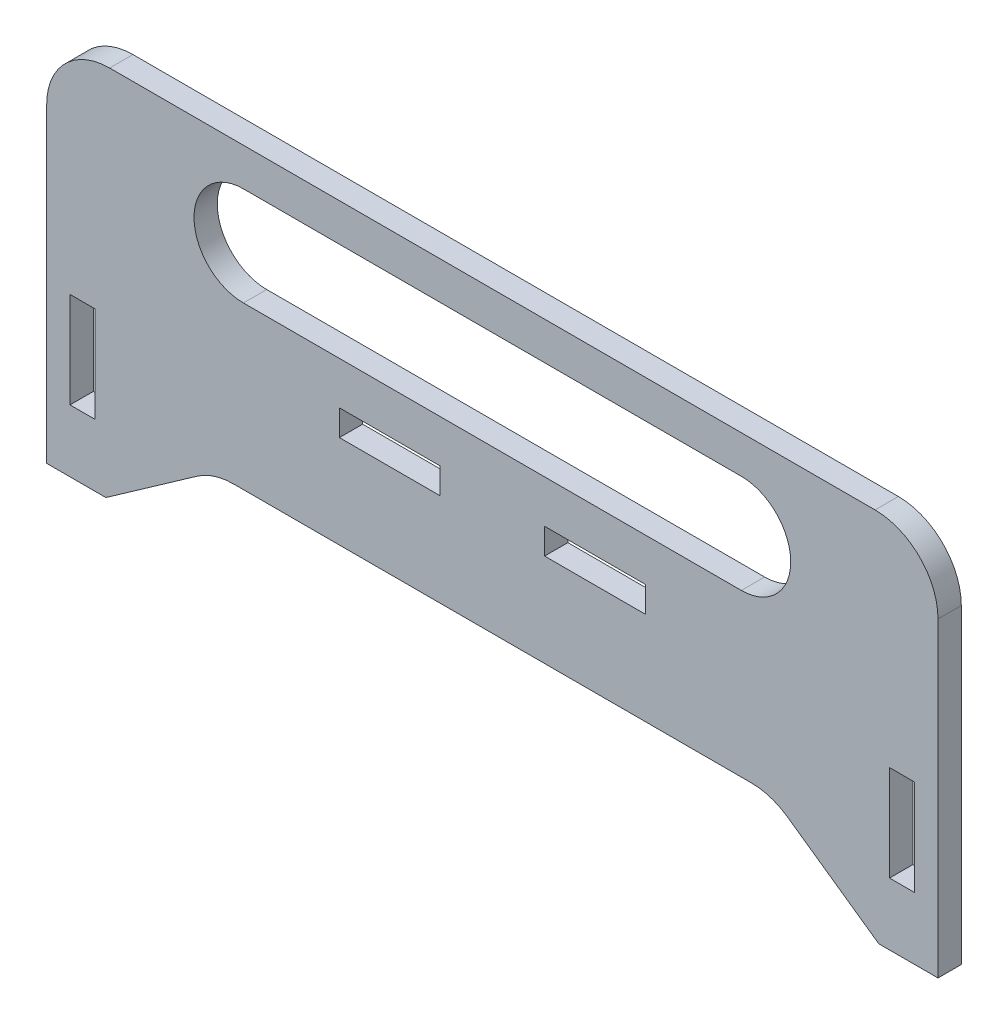
ISO-10303-21;
HEADER;
FILE_DESCRIPTION(('STEP AP214'),'2;1');
FILE_NAME('part.step','',(''),(''),'','','');
FILE_SCHEMA(('AUTOMOTIVE_DESIGN { 1 0 10303 214 1 1 1 1 }'));
ENDSEC;
DATA;
#1=APPLICATION_CONTEXT('core data for automotive mechanical design processes');
#2=APPLICATION_PROTOCOL_DEFINITION('international standard','automotive_design',2000,#1);
#3=PRODUCT_CONTEXT('',#1,'mechanical');
#4=PRODUCT('Part','Part','',(#3));
#5=PRODUCT_RELATED_PRODUCT_CATEGORY('part','',(#4));
#6=PRODUCT_DEFINITION_FORMATION('','',#4);
#7=PRODUCT_DEFINITION_CONTEXT('part definition',#1,'design');
#8=PRODUCT_DEFINITION('design','',#6,#7);
#9=PRODUCT_DEFINITION_SHAPE('','',#8);
#10=(LENGTH_UNIT() NAMED_UNIT(*) SI_UNIT(.MILLI.,.METRE.));
#11=(NAMED_UNIT(*) PLANE_ANGLE_UNIT() SI_UNIT($,.RADIAN.));
#12=(NAMED_UNIT(*) SI_UNIT($,.STERADIAN.) SOLID_ANGLE_UNIT());
#13=UNCERTAINTY_MEASURE_WITH_UNIT(LENGTH_MEASURE(1.E-05),#10,'distance_accuracy_value','');
#14=(GEOMETRIC_REPRESENTATION_CONTEXT(3) GLOBAL_UNCERTAINTY_ASSIGNED_CONTEXT((#13)) GLOBAL_UNIT_ASSIGNED_CONTEXT((#10,
#11,#12)) REPRESENTATION_CONTEXT('',''));
#15=CARTESIAN_POINT('',(0.,0.,0.));
#16=DIRECTION('',(0.,0.,1.));
#17=DIRECTION('',(1.,0.,0.));
#18=AXIS2_PLACEMENT_3D('',#15,#16,#17);
#19=CARTESIAN_POINT('',(0.,0.,3.7));
#20=DIRECTION('',(0.,0.,1.));
#21=DIRECTION('',(1.,0.,0.));
#22=AXIS2_PLACEMENT_3D('',#19,#20,#21);
#23=PLANE('',#22);
#24=DIRECTION('',(-1.,0.,0.));
#25=VECTOR('',#24,1.);
#26=CARTESIAN_POINT('',(-110.178290247756,0.,3.7));
#27=LINE('',#26,#25);
#28=CARTESIAN_POINT('',(21.4217097522439,0.,3.7));
#29=VERTEX_POINT('',#28);
#30=CARTESIAN_POINT('',(-100.178290247756,0.,3.7));
#31=VERTEX_POINT('',#30);
#32=EDGE_CURVE('E427',#29,#31,#27,.T.);
#33=ORIENTED_EDGE('',*,*,#32,.T.);
#34=CARTESIAN_POINT('',(-100.178290247756,-10.,3.7));
#35=DIRECTION('',(0.,0.,1.));
#36=DIRECTION('',(1.,0.,0.));
#37=AXIS2_PLACEMENT_3D('',#34,#35,#36);
#38=CIRCLE('',#37,10.);
#39=CARTESIAN_POINT('',(-110.178290247756,-10.,3.7));
#40=VERTEX_POINT('',#39);
#41=EDGE_CURVE('E473',#31,#40,#38,.T.);
#42=ORIENTED_EDGE('',*,*,#41,.T.);
#43=DIRECTION('',(0.,-1.,0.));
#44=VECTOR('',#43,1.);
#45=CARTESIAN_POINT('',(-110.178290247756,0.,3.7));
#46=LINE('',#45,#44);
#47=CARTESIAN_POINT('',(-110.178290247756,-59.4,3.7));
#48=VERTEX_POINT('',#47);
#49=EDGE_CURVE('E410',#40,#48,#46,.T.);
#50=ORIENTED_EDGE('',*,*,#49,.T.);
#51=DIRECTION('',(1.,0.,0.));
#52=VECTOR('',#51,1.);
#53=CARTESIAN_POINT('',(-110.178290247756,-59.4,3.7));
#54=LINE('',#53,#52);
#55=CARTESIAN_POINT('',(-100.778290247756,-59.4,3.7));
#56=VERTEX_POINT('',#55);
#57=EDGE_CURVE('E412',#48,#56,#54,.T.);
#58=ORIENTED_EDGE('',*,*,#57,.T.);
#59=DIRECTION('',(0.818181818181818,0.574959574576069,0.));
#60=VECTOR('',#59,1.);
#61=CARTESIAN_POINT('',(-100.778290247756,-59.4,3.7));
#62=LINE('',#61,#60);
#63=CARTESIAN_POINT('',(-86.2656083333484,-49.201526709542,3.7));
#64=VERTEX_POINT('',#63);
#65=EDGE_CURVE('E415',#56,#64,#62,.T.);
#66=ORIENTED_EDGE('',*,*,#65,.T.);
#67=CARTESIAN_POINT('',(-80.5160125875877,-57.3833448913602,3.7));
#68=DIRECTION('',(0.,0.,1.));
#69=DIRECTION('',(1.,0.,0.));
#70=AXIS2_PLACEMENT_3D('',#67,#68,#69);
#71=CIRCLE('',#70,10.);
#72=CARTESIAN_POINT('',(-80.5160125875877,-47.3833448913602,3.7));
#73=VERTEX_POINT('',#72);
#74=EDGE_CURVE('E11',#64,#73,#71,.F.);
#75=ORIENTED_EDGE('',*,*,#74,.T.);
#76=DIRECTION('',(1.,0.,0.));
#77=VECTOR('',#76,1.);
#78=CARTESIAN_POINT('',(-83.6782902477561,-47.3833448913602,3.7));
#79=LINE('',#78,#77);
#80=CARTESIAN_POINT('',(1.75943209207553,-47.3833448913602,3.7));
#81=VERTEX_POINT('',#80);
#82=EDGE_CURVE('E417',#73,#81,#79,.T.);
#83=ORIENTED_EDGE('',*,*,#82,.T.);
#84=CARTESIAN_POINT('',(1.75943209207554,-57.3833448913602,3.7));
#85=DIRECTION('',(0.,0.,1.));
#86=DIRECTION('',(1.,0.,0.));
#87=AXIS2_PLACEMENT_3D('',#84,#85,#86);
#88=CIRCLE('',#87,10.);
#89=CARTESIAN_POINT('',(7.50902783783623,-49.201526709542,3.7));
#90=VERTEX_POINT('',#89);
#91=EDGE_CURVE('E488',#81,#90,#88,.F.);
#92=ORIENTED_EDGE('',*,*,#91,.T.);
#93=DIRECTION('',(0.818181818181818,-0.574959574576069,0.));
#94=VECTOR('',#93,1.);
#95=CARTESIAN_POINT('',(4.92170975224391,-47.3833448913602,3.7));
#96=LINE('',#95,#94);
#97=CARTESIAN_POINT('',(22.0217097522439,-59.4,3.7));
#98=VERTEX_POINT('',#97);
#99=EDGE_CURVE('E420',#90,#98,#96,.T.);
#100=ORIENTED_EDGE('',*,*,#99,.T.);
#101=DIRECTION('',(1.,0.,0.));
#102=VECTOR('',#101,1.);
#103=CARTESIAN_POINT('',(22.0217097522439,-59.4,3.7));
#104=LINE('',#103,#102);
#105=CARTESIAN_POINT('',(31.4217097522439,-59.4,3.7));
#106=VERTEX_POINT('',#105);
#107=EDGE_CURVE('E422',#98,#106,#104,.T.);
#108=ORIENTED_EDGE('',*,*,#107,.T.);
#109=DIRECTION('',(0.,1.,0.));
#110=VECTOR('',#109,1.);
#111=CARTESIAN_POINT('',(31.4217097522439,0.,3.7));
#112=LINE('',#111,#110);
#113=CARTESIAN_POINT('',(31.4217097522439,-10.,3.7));
#114=VERTEX_POINT('',#113);
#115=EDGE_CURVE('E424',#106,#114,#112,.T.);
#116=ORIENTED_EDGE('',*,*,#115,.T.);
#117=CARTESIAN_POINT('',(21.4217097522439,-10.,3.7));
#118=DIRECTION('',(0.,0.,1.));
#119=DIRECTION('',(1.,0.,0.));
#120=AXIS2_PLACEMENT_3D('',#117,#118,#119);
#121=CIRCLE('',#120,10.);
#122=EDGE_CURVE('E471',#114,#29,#121,.T.);
#123=ORIENTED_EDGE('',*,*,#122,.T.);
#124=EDGE_LOOP('',(#33,#42,#50,#58,#66,#75,#83,#92,#100,#108,#116,#123));
#125=FACE_BOUND('',#124,.T.);
#126=DIRECTION('',(-1.,0.,0.));
#127=VECTOR('',#126,1.);
#128=CARTESIAN_POINT('',(0.171709752243898,-5.99999999999999,3.7));
#129=LINE('',#128,#127);
#130=CARTESIAN_POINT('',(0.171709752243898,-5.99999999999999,3.7));
#131=VERTEX_POINT('',#130);
#132=CARTESIAN_POINT('',(-78.9282902477561,-5.99999999999999,3.7));
#133=VERTEX_POINT('',#132);
#134=EDGE_CURVE('E381',#131,#133,#129,.T.);
#135=ORIENTED_EDGE('',*,*,#134,.F.);
#136=CARTESIAN_POINT('',(0.171709752243897,-13.85,3.7));
#137=DIRECTION('',(0.,0.,1.));
#138=DIRECTION('',(1.,0.,0.));
#139=AXIS2_PLACEMENT_3D('',#136,#137,#138);
#140=CIRCLE('',#139,7.84999999999999);
#141=CARTESIAN_POINT('',(0.171709752243898,-21.7,3.7));
#142=VERTEX_POINT('',#141);
#143=EDGE_CURVE('E379',#142,#131,#140,.T.);
#144=ORIENTED_EDGE('',*,*,#143,.F.);
#145=DIRECTION('',(1.,0.,0.));
#146=VECTOR('',#145,1.);
#147=CARTESIAN_POINT('',(0.171709752243898,-21.7,3.7));
#148=LINE('',#147,#146);
#149=CARTESIAN_POINT('',(-78.9282902477561,-21.7,3.7));
#150=VERTEX_POINT('',#149);
#151=EDGE_CURVE('E387',#150,#142,#148,.T.);
#152=ORIENTED_EDGE('',*,*,#151,.F.);
#153=CARTESIAN_POINT('',(-78.9282902477561,-13.85,3.7));
#154=DIRECTION('',(0.,0.,1.));
#155=DIRECTION('',(1.,0.,0.));
#156=AXIS2_PLACEMENT_3D('',#153,#154,#155);
#157=CIRCLE('',#156,7.84999999999999);
#158=EDGE_CURVE('E384',#133,#150,#157,.T.);
#159=ORIENTED_EDGE('',*,*,#158,.F.);
#160=EDGE_LOOP('',(#135,#144,#152,#159));
#161=FACE_BOUND('',#160,.T.);
#162=DIRECTION('',(1.,0.,0.));
#163=VECTOR('',#162,1.);
#164=CARTESIAN_POINT('',(-47.6782902477561,-32.6,3.7));
#165=LINE('',#164,#163);
#166=CARTESIAN_POINT('',(-63.6782902477561,-32.6,3.7));
#167=VERTEX_POINT('',#166);
#168=CARTESIAN_POINT('',(-47.6782902477561,-32.6,3.7));
#169=VERTEX_POINT('',#168);
#170=EDGE_CURVE('E350',#167,#169,#165,.T.);
#171=ORIENTED_EDGE('',*,*,#170,.F.);
#172=DIRECTION('',(0.,-1.,0.));
#173=VECTOR('',#172,1.);
#174=CARTESIAN_POINT('',(-63.6782902477561,-32.6,3.7));
#175=LINE('',#174,#173);
#176=CARTESIAN_POINT('',(-63.6782902477561,-28.5,3.7));
#177=VERTEX_POINT('',#176);
#178=EDGE_CURVE('E348',#177,#167,#175,.T.);
#179=ORIENTED_EDGE('',*,*,#178,.F.);
#180=DIRECTION('',(-1.,0.,0.));
#181=VECTOR('',#180,1.);
#182=CARTESIAN_POINT('',(-47.6782902477561,-28.5,3.7));
#183=LINE('',#182,#181);
#184=CARTESIAN_POINT('',(-47.6782902477561,-28.5,3.7));
#185=VERTEX_POINT('',#184);
#186=EDGE_CURVE('E356',#185,#177,#183,.T.);
#187=ORIENTED_EDGE('',*,*,#186,.F.);
#188=DIRECTION('',(0.,1.,0.));
#189=VECTOR('',#188,1.);
#190=CARTESIAN_POINT('',(-47.6782902477561,-32.6,3.7));
#191=LINE('',#190,#189);
#192=EDGE_CURVE('E353',#169,#185,#191,.T.);
#193=ORIENTED_EDGE('',*,*,#192,.F.);
#194=EDGE_LOOP('',(#171,#179,#187,#193));
#195=FACE_BOUND('',#194,.T.);
#196=DIRECTION('',(0.,1.,0.));
#197=VECTOR('',#196,1.);
#198=CARTESIAN_POINT('',(-15.0782902477561,-32.6,3.7));
#199=LINE('',#198,#197);
#200=CARTESIAN_POINT('',(-15.0782902477561,-32.6,3.7));
#201=VERTEX_POINT('',#200);
#202=CARTESIAN_POINT('',(-15.0782902477561,-28.5,3.7));
#203=VERTEX_POINT('',#202);
#204=EDGE_CURVE('E319',#201,#203,#199,.T.);
#205=ORIENTED_EDGE('',*,*,#204,.F.);
#206=DIRECTION('',(1.,0.,0.));
#207=VECTOR('',#206,1.);
#208=CARTESIAN_POINT('',(-31.0782902477561,-32.6,3.7));
#209=LINE('',#208,#207);
#210=CARTESIAN_POINT('',(-31.0782902477561,-32.6,3.7));
#211=VERTEX_POINT('',#210);
#212=EDGE_CURVE('E317',#211,#201,#209,.T.);
#213=ORIENTED_EDGE('',*,*,#212,.F.);
#214=DIRECTION('',(0.,-1.,0.));
#215=VECTOR('',#214,1.);
#216=CARTESIAN_POINT('',(-31.0782902477561,-32.6,3.7));
#217=LINE('',#216,#215);
#218=CARTESIAN_POINT('',(-31.0782902477561,-28.5,3.7));
#219=VERTEX_POINT('',#218);
#220=EDGE_CURVE('E325',#219,#211,#217,.T.);
#221=ORIENTED_EDGE('',*,*,#220,.F.);
#222=DIRECTION('',(-1.,0.,0.));
#223=VECTOR('',#222,1.);
#224=CARTESIAN_POINT('',(-31.0782902477561,-28.5,3.7));
#225=LINE('',#224,#223);
#226=EDGE_CURVE('E322',#203,#219,#225,.T.);
#227=ORIENTED_EDGE('',*,*,#226,.F.);
#228=EDGE_LOOP('',(#205,#213,#221,#227));
#229=FACE_BOUND('',#228,.T.);
#230=DIRECTION('',(-1.,0.,0.));
#231=VECTOR('',#230,1.);
#232=CARTESIAN_POINT('',(-106.478290247756,-34.3,3.7));
#233=LINE('',#232,#231);
#234=CARTESIAN_POINT('',(-102.478290247756,-34.3,3.7));
#235=VERTEX_POINT('',#234);
#236=CARTESIAN_POINT('',(-106.478290247756,-34.3,3.7));
#237=VERTEX_POINT('',#236);
#238=EDGE_CURVE('E288',#235,#237,#233,.T.);
#239=ORIENTED_EDGE('',*,*,#238,.F.);
#240=DIRECTION('',(0.,1.,0.));
#241=VECTOR('',#240,1.);
#242=CARTESIAN_POINT('',(-102.478290247756,-34.3,3.7));
#243=LINE('',#242,#241);
#244=CARTESIAN_POINT('',(-102.478290247756,-49.5,3.7));
#245=VERTEX_POINT('',#244);
#246=EDGE_CURVE('E286',#245,#235,#243,.T.);
#247=ORIENTED_EDGE('',*,*,#246,.F.);
#248=DIRECTION('',(1.,0.,0.));
#249=VECTOR('',#248,1.);
#250=CARTESIAN_POINT('',(-106.478290247756,-49.5,3.7));
#251=LINE('',#250,#249);
#252=CARTESIAN_POINT('',(-106.478290247756,-49.5,3.7));
#253=VERTEX_POINT('',#252);
#254=EDGE_CURVE('E294',#253,#245,#251,.T.);
#255=ORIENTED_EDGE('',*,*,#254,.F.);
#256=DIRECTION('',(0.,-1.,0.));
#257=VECTOR('',#256,1.);
#258=CARTESIAN_POINT('',(-106.478290247756,-34.3,3.7));
#259=LINE('',#258,#257);
#260=EDGE_CURVE('E291',#237,#253,#259,.T.);
#261=ORIENTED_EDGE('',*,*,#260,.F.);
#262=EDGE_LOOP('',(#239,#247,#255,#261));
#263=FACE_BOUND('',#262,.T.);
#264=DIRECTION('',(-1.,0.,0.));
#265=VECTOR('',#264,1.);
#266=CARTESIAN_POINT('',(27.7217097522439,-34.3,3.7));
#267=LINE('',#266,#265);
#268=CARTESIAN_POINT('',(27.7217097522439,-34.3,3.7));
#269=VERTEX_POINT('',#268);
#270=CARTESIAN_POINT('',(23.7217097522439,-34.3,3.7));
#271=VERTEX_POINT('',#270);
#272=EDGE_CURVE('E255',#269,#271,#267,.T.);
#273=ORIENTED_EDGE('',*,*,#272,.F.);
#274=DIRECTION('',(0.,1.,0.));
#275=VECTOR('',#274,1.);
#276=CARTESIAN_POINT('',(27.7217097522439,-34.3,3.7));
#277=LINE('',#276,#275);
#278=CARTESIAN_POINT('',(27.7217097522439,-49.5,3.7));
#279=VERTEX_POINT('',#278);
#280=EDGE_CURVE('E245',#279,#269,#277,.T.);
#281=ORIENTED_EDGE('',*,*,#280,.F.);
#282=DIRECTION('',(1.,0.,0.));
#283=VECTOR('',#282,1.);
#284=CARTESIAN_POINT('',(27.7217097522439,-49.5,3.7));
#285=LINE('',#284,#283);
#286=CARTESIAN_POINT('',(23.7217097522439,-49.5,3.7));
#287=VERTEX_POINT('',#286);
#288=EDGE_CURVE('E270',#287,#279,#285,.T.);
#289=ORIENTED_EDGE('',*,*,#288,.F.);
#290=DIRECTION('',(0.,-1.,0.));
#291=VECTOR('',#290,1.);
#292=CARTESIAN_POINT('',(23.7217097522439,-34.3,3.7));
#293=LINE('',#292,#291);
#294=EDGE_CURVE('E268',#271,#287,#293,.T.);
#295=ORIENTED_EDGE('',*,*,#294,.F.);
#296=EDGE_LOOP('',(#273,#281,#289,#295));
#297=FACE_BOUND('',#296,.T.);
#298=ADVANCED_FACE('F35',(#125,#161,#195,#229,#263,#297),#23,.T.);
#299=CARTESIAN_POINT('',(0.,0.,0.));
#300=DIRECTION('',(0.,0.,1.));
#301=DIRECTION('',(1.,0.,0.));
#302=AXIS2_PLACEMENT_3D('',#299,#300,#301);
#303=PLANE('',#302);
#304=DIRECTION('',(0.,1.,0.));
#305=VECTOR('',#304,1.);
#306=CARTESIAN_POINT('',(-102.478290247756,-34.3,0.));
#307=LINE('',#306,#305);
#308=CARTESIAN_POINT('',(-102.478290247756,-49.5,0.));
#309=VERTEX_POINT('',#308);
#310=CARTESIAN_POINT('',(-102.478290247756,-34.3,0.));
#311=VERTEX_POINT('',#310);
#312=EDGE_CURVE('E263',#309,#311,#307,.T.);
#313=ORIENTED_EDGE('',*,*,#312,.T.);
#314=DIRECTION('',(-1.,0.,0.));
#315=VECTOR('',#314,1.);
#316=CARTESIAN_POINT('',(-106.478290247756,-34.3,0.));
#317=LINE('',#316,#315);
#318=CARTESIAN_POINT('',(-106.478290247756,-34.3,0.));
#319=VERTEX_POINT('',#318);
#320=EDGE_CURVE('E299',#311,#319,#317,.T.);
#321=ORIENTED_EDGE('',*,*,#320,.T.);
#322=DIRECTION('',(0.,-1.,0.));
#323=VECTOR('',#322,1.);
#324=CARTESIAN_POINT('',(-106.478290247756,-34.3,0.));
#325=LINE('',#324,#323);
#326=CARTESIAN_POINT('',(-106.478290247756,-49.5,0.));
#327=VERTEX_POINT('',#326);
#328=EDGE_CURVE('E302',#319,#327,#325,.T.);
#329=ORIENTED_EDGE('',*,*,#328,.T.);
#330=DIRECTION('',(1.,0.,0.));
#331=VECTOR('',#330,1.);
#332=CARTESIAN_POINT('',(-106.478290247756,-49.5,0.));
#333=LINE('',#332,#331);
#334=EDGE_CURVE('E289',#327,#309,#333,.T.);
#335=ORIENTED_EDGE('',*,*,#334,.T.);
#336=EDGE_LOOP('',(#313,#321,#329,#335));
#337=FACE_BOUND('',#336,.T.);
#338=DIRECTION('',(0.,-1.,0.));
#339=VECTOR('',#338,1.);
#340=CARTESIAN_POINT('',(-63.6782902477561,-32.6,0.));
#341=LINE('',#340,#339);
#342=CARTESIAN_POINT('',(-63.6782902477561,-28.5,0.));
#343=VERTEX_POINT('',#342);
#344=CARTESIAN_POINT('',(-63.6782902477561,-32.6,0.));
#345=VERTEX_POINT('',#344);
#346=EDGE_CURVE('E347',#343,#345,#341,.T.);
#347=ORIENTED_EDGE('',*,*,#346,.T.);
#348=DIRECTION('',(1.,0.,0.));
#349=VECTOR('',#348,1.);
#350=CARTESIAN_POINT('',(-47.6782902477561,-32.6,0.));
#351=LINE('',#350,#349);
#352=CARTESIAN_POINT('',(-47.6782902477561,-32.6,0.));
#353=VERTEX_POINT('',#352);
#354=EDGE_CURVE('E361',#345,#353,#351,.T.);
#355=ORIENTED_EDGE('',*,*,#354,.T.);
#356=DIRECTION('',(0.,1.,0.));
#357=VECTOR('',#356,1.);
#358=CARTESIAN_POINT('',(-47.6782902477561,-32.6,0.));
#359=LINE('',#358,#357);
#360=CARTESIAN_POINT('',(-47.6782902477561,-28.5,0.));
#361=VERTEX_POINT('',#360);
#362=EDGE_CURVE('E364',#353,#361,#359,.T.);
#363=ORIENTED_EDGE('',*,*,#362,.T.);
#364=DIRECTION('',(-1.,0.,0.));
#365=VECTOR('',#364,1.);
#366=CARTESIAN_POINT('',(-47.6782902477561,-28.5,0.));
#367=LINE('',#366,#365);
#368=EDGE_CURVE('E351',#361,#343,#367,.T.);
#369=ORIENTED_EDGE('',*,*,#368,.T.);
#370=EDGE_LOOP('',(#347,#355,#363,#369));
#371=FACE_BOUND('',#370,.T.);
#372=DIRECTION('',(0.,-1.,0.));
#373=VECTOR('',#372,1.);
#374=CARTESIAN_POINT('',(-110.178290247756,0.,0.));
#375=LINE('',#374,#373);
#376=CARTESIAN_POINT('',(-110.178290247756,-10.,0.));
#377=VERTEX_POINT('',#376);
#378=CARTESIAN_POINT('',(-110.178290247756,-59.4,0.));
#379=VERTEX_POINT('',#378);
#380=EDGE_CURVE('E409',#377,#379,#375,.T.);
#381=ORIENTED_EDGE('',*,*,#380,.F.);
#382=CARTESIAN_POINT('',(-100.178290247756,-10.,0.));
#383=DIRECTION('',(0.,0.,1.));
#384=DIRECTION('',(1.,0.,0.));
#385=AXIS2_PLACEMENT_3D('',#382,#383,#384);
#386=CIRCLE('',#385,10.);
#387=CARTESIAN_POINT('',(-100.178290247756,0.,0.));
#388=VERTEX_POINT('',#387);
#389=EDGE_CURVE('E464',#377,#388,#386,.F.);
#390=ORIENTED_EDGE('',*,*,#389,.T.);
#391=DIRECTION('',(-1.,0.,0.));
#392=VECTOR('',#391,1.);
#393=CARTESIAN_POINT('',(-110.178290247756,0.,0.));
#394=LINE('',#393,#392);
#395=CARTESIAN_POINT('',(21.4217097522439,0.,0.));
#396=VERTEX_POINT('',#395);
#397=EDGE_CURVE('E413',#396,#388,#394,.T.);
#398=ORIENTED_EDGE('',*,*,#397,.F.);
#399=CARTESIAN_POINT('',(21.4217097522439,-10.,0.));
#400=DIRECTION('',(0.,0.,1.));
#401=DIRECTION('',(1.,0.,0.));
#402=AXIS2_PLACEMENT_3D('',#399,#400,#401);
#403=CIRCLE('',#402,10.);
#404=CARTESIAN_POINT('',(31.4217097522439,-10.,0.));
#405=VERTEX_POINT('',#404);
#406=EDGE_CURVE('E462',#396,#405,#403,.F.);
#407=ORIENTED_EDGE('',*,*,#406,.T.);
#408=DIRECTION('',(0.,1.,0.));
#409=VECTOR('',#408,1.);
#410=CARTESIAN_POINT('',(31.4217097522439,0.,0.));
#411=LINE('',#410,#409);
#412=CARTESIAN_POINT('',(31.4217097522439,-59.4,0.));
#413=VERTEX_POINT('',#412);
#414=EDGE_CURVE('E443',#413,#405,#411,.T.);
#415=ORIENTED_EDGE('',*,*,#414,.F.);
#416=DIRECTION('',(1.,0.,0.));
#417=VECTOR('',#416,1.);
#418=CARTESIAN_POINT('',(22.0217097522439,-59.4,0.));
#419=LINE('',#418,#417);
#420=CARTESIAN_POINT('',(22.0217097522439,-59.4,0.));
#421=VERTEX_POINT('',#420);
#422=EDGE_CURVE('E441',#421,#413,#419,.T.);
#423=ORIENTED_EDGE('',*,*,#422,.F.);
#424=DIRECTION('',(0.818181818181818,-0.574959574576069,0.));
#425=VECTOR('',#424,1.);
#426=CARTESIAN_POINT('',(4.92170975224391,-47.3833448913602,0.));
#427=LINE('',#426,#425);
#428=CARTESIAN_POINT('',(7.50902783783623,-49.201526709542,0.));
#429=VERTEX_POINT('',#428);
#430=EDGE_CURVE('E439',#429,#421,#427,.T.);
#431=ORIENTED_EDGE('',*,*,#430,.F.);
#432=CARTESIAN_POINT('',(1.75943209207554,-57.3833448913602,0.));
#433=DIRECTION('',(0.,0.,1.));
#434=DIRECTION('',(1.,0.,0.));
#435=AXIS2_PLACEMENT_3D('',#432,#433,#434);
#436=CIRCLE('',#435,10.);
#437=CARTESIAN_POINT('',(1.75943209207553,-47.3833448913602,0.));
#438=VERTEX_POINT('',#437);
#439=EDGE_CURVE('E486',#429,#438,#436,.T.);
#440=ORIENTED_EDGE('',*,*,#439,.T.);
#441=DIRECTION('',(1.,0.,0.));
#442=VECTOR('',#441,1.);
#443=CARTESIAN_POINT('',(-83.6782902477561,-47.3833448913602,0.));
#444=LINE('',#443,#442);
#445=CARTESIAN_POINT('',(-80.5160125875877,-47.3833448913602,0.));
#446=VERTEX_POINT('',#445);
#447=EDGE_CURVE('E436',#446,#438,#444,.T.);
#448=ORIENTED_EDGE('',*,*,#447,.F.);
#449=CARTESIAN_POINT('',(-80.5160125875877,-57.3833448913602,0.));
#450=DIRECTION('',(0.,0.,1.));
#451=DIRECTION('',(1.,0.,0.));
#452=AXIS2_PLACEMENT_3D('',#449,#450,#451);
#453=CIRCLE('',#452,10.);
#454=CARTESIAN_POINT('',(-86.2656083333484,-49.201526709542,0.));
#455=VERTEX_POINT('',#454);
#456=EDGE_CURVE('E43',#446,#455,#453,.T.);
#457=ORIENTED_EDGE('',*,*,#456,.T.);
#458=DIRECTION('',(0.818181818181818,0.574959574576069,0.));
#459=VECTOR('',#458,1.);
#460=CARTESIAN_POINT('',(-100.778290247756,-59.4,0.));
#461=LINE('',#460,#459);
#462=CARTESIAN_POINT('',(-100.778290247756,-59.4,0.));
#463=VERTEX_POINT('',#462);
#464=EDGE_CURVE('E434',#463,#455,#461,.T.);
#465=ORIENTED_EDGE('',*,*,#464,.F.);
#466=DIRECTION('',(1.,0.,0.));
#467=VECTOR('',#466,1.);
#468=CARTESIAN_POINT('',(-110.178290247756,-59.4,0.));
#469=LINE('',#468,#467);
#470=EDGE_CURVE('E432',#379,#463,#469,.T.);
#471=ORIENTED_EDGE('',*,*,#470,.F.);
#472=EDGE_LOOP('',(#381,#390,#398,#407,#415,#423,#431,#440,#448,#457,#465,#471));
#473=FACE_BOUND('',#472,.T.);
#474=CARTESIAN_POINT('',(0.171709752243897,-13.85,0.));
#475=DIRECTION('',(0.,0.,1.));
#476=DIRECTION('',(1.,0.,0.));
#477=AXIS2_PLACEMENT_3D('',#474,#475,#476);
#478=CIRCLE('',#477,7.84999999999999);
#479=CARTESIAN_POINT('',(0.171709752243898,-21.7,0.));
#480=VERTEX_POINT('',#479);
#481=CARTESIAN_POINT('',(0.171709752243898,-5.99999999999999,0.));
#482=VERTEX_POINT('',#481);
#483=EDGE_CURVE('E378',#480,#482,#478,.T.);
#484=ORIENTED_EDGE('',*,*,#483,.T.);
#485=DIRECTION('',(-1.,0.,0.));
#486=VECTOR('',#485,1.);
#487=CARTESIAN_POINT('',(0.171709752243898,-5.99999999999999,0.));
#488=LINE('',#487,#486);
#489=CARTESIAN_POINT('',(-78.9282902477561,-5.99999999999999,0.));
#490=VERTEX_POINT('',#489);
#491=EDGE_CURVE('E392',#482,#490,#488,.T.);
#492=ORIENTED_EDGE('',*,*,#491,.T.);
#493=CARTESIAN_POINT('',(-78.9282902477561,-13.85,0.));
#494=DIRECTION('',(0.,0.,1.));
#495=DIRECTION('',(1.,0.,0.));
#496=AXIS2_PLACEMENT_3D('',#493,#494,#495);
#497=CIRCLE('',#496,7.84999999999999);
#498=CARTESIAN_POINT('',(-78.9282902477561,-21.7,0.));
#499=VERTEX_POINT('',#498);
#500=EDGE_CURVE('E395',#490,#499,#497,.T.);
#501=ORIENTED_EDGE('',*,*,#500,.T.);
#502=DIRECTION('',(1.,0.,0.));
#503=VECTOR('',#502,1.);
#504=CARTESIAN_POINT('',(0.171709752243898,-21.7,0.));
#505=LINE('',#504,#503);
#506=EDGE_CURVE('E382',#499,#480,#505,.T.);
#507=ORIENTED_EDGE('',*,*,#506,.T.);
#508=EDGE_LOOP('',(#484,#492,#501,#507));
#509=FACE_BOUND('',#508,.T.);
#510=DIRECTION('',(1.,0.,0.));
#511=VECTOR('',#510,1.);
#512=CARTESIAN_POINT('',(-31.0782902477561,-32.6,0.));
#513=LINE('',#512,#511);
#514=CARTESIAN_POINT('',(-31.0782902477561,-32.6,0.));
#515=VERTEX_POINT('',#514);
#516=CARTESIAN_POINT('',(-15.0782902477561,-32.6,0.));
#517=VERTEX_POINT('',#516);
#518=EDGE_CURVE('E316',#515,#517,#513,.T.);
#519=ORIENTED_EDGE('',*,*,#518,.T.);
#520=DIRECTION('',(0.,1.,0.));
#521=VECTOR('',#520,1.);
#522=CARTESIAN_POINT('',(-15.0782902477561,-32.6,0.));
#523=LINE('',#522,#521);
#524=CARTESIAN_POINT('',(-15.0782902477561,-28.5,0.));
#525=VERTEX_POINT('',#524);
#526=EDGE_CURVE('E330',#517,#525,#523,.T.);
#527=ORIENTED_EDGE('',*,*,#526,.T.);
#528=DIRECTION('',(-1.,0.,0.));
#529=VECTOR('',#528,1.);
#530=CARTESIAN_POINT('',(-31.0782902477561,-28.5,0.));
#531=LINE('',#530,#529);
#532=CARTESIAN_POINT('',(-31.0782902477561,-28.5,0.));
#533=VERTEX_POINT('',#532);
#534=EDGE_CURVE('E333',#525,#533,#531,.T.);
#535=ORIENTED_EDGE('',*,*,#534,.T.);
#536=DIRECTION('',(0.,-1.,0.));
#537=VECTOR('',#536,1.);
#538=CARTESIAN_POINT('',(-31.0782902477561,-32.6,0.));
#539=LINE('',#538,#537);
#540=EDGE_CURVE('E320',#533,#515,#539,.T.);
#541=ORIENTED_EDGE('',*,*,#540,.T.);
#542=EDGE_LOOP('',(#519,#527,#535,#541));
#543=FACE_BOUND('',#542,.T.);
#544=DIRECTION('',(0.,1.,0.));
#545=VECTOR('',#544,1.);
#546=CARTESIAN_POINT('',(27.7217097522439,-34.3,0.));
#547=LINE('',#546,#545);
#548=CARTESIAN_POINT('',(27.7217097522439,-49.5,0.));
#549=VERTEX_POINT('',#548);
#550=CARTESIAN_POINT('',(27.7217097522439,-34.3,0.));
#551=VERTEX_POINT('',#550);
#552=EDGE_CURVE('E274',#549,#551,#547,.T.);
#553=ORIENTED_EDGE('',*,*,#552,.T.);
#554=DIRECTION('',(-1.,0.,0.));
#555=VECTOR('',#554,1.);
#556=CARTESIAN_POINT('',(27.7217097522439,-34.3,0.));
#557=LINE('',#556,#555);
#558=CARTESIAN_POINT('',(23.7217097522439,-34.3,0.));
#559=VERTEX_POINT('',#558);
#560=EDGE_CURVE('E262',#551,#559,#557,.T.);
#561=ORIENTED_EDGE('',*,*,#560,.T.);
#562=DIRECTION('',(0.,-1.,0.));
#563=VECTOR('',#562,1.);
#564=CARTESIAN_POINT('',(23.7217097522439,-34.3,0.));
#565=LINE('',#564,#563);
#566=CARTESIAN_POINT('',(23.7217097522439,-49.5,0.));
#567=VERTEX_POINT('',#566);
#568=EDGE_CURVE('E277',#559,#567,#565,.T.);
#569=ORIENTED_EDGE('',*,*,#568,.T.);
#570=DIRECTION('',(1.,0.,0.));
#571=VECTOR('',#570,1.);
#572=CARTESIAN_POINT('',(27.7217097522439,-49.5,0.));
#573=LINE('',#572,#571);
#574=EDGE_CURVE('E256',#567,#549,#573,.T.);
#575=ORIENTED_EDGE('',*,*,#574,.T.);
#576=EDGE_LOOP('',(#553,#561,#569,#575));
#577=FACE_BOUND('',#576,.T.);
#578=ADVANCED_FACE('F504',(#337,#371,#473,#509,#543,#577),#303,.F.);
#579=CARTESIAN_POINT('',(-110.178290247756,0.,3.7));
#580=DIRECTION('',(1.,0.,0.));
#581=DIRECTION('',(0.,0.,-1.));
#582=AXIS2_PLACEMENT_3D('',#579,#580,#581);
#583=PLANE('',#582);
#584=ORIENTED_EDGE('',*,*,#49,.F.);
#585=DIRECTION('',(0.,0.,-1.));
#586=VECTOR('',#585,1.);
#587=CARTESIAN_POINT('',(-110.178290247756,-10.,3.7));
#588=LINE('',#587,#586);
#589=EDGE_CURVE('E459',#40,#377,#588,.T.);
#590=ORIENTED_EDGE('',*,*,#589,.T.);
#591=ORIENTED_EDGE('',*,*,#380,.T.);
#592=DIRECTION('',(0.,0.,-1.));
#593=VECTOR('',#592,1.);
#594=CARTESIAN_POINT('',(-110.178290247756,-59.4,3.7));
#595=LINE('',#594,#593);
#596=EDGE_CURVE('E456',#48,#379,#595,.T.);
#597=ORIENTED_EDGE('',*,*,#596,.F.);
#598=EDGE_LOOP('',(#584,#590,#591,#597));
#599=FACE_BOUND('',#598,.T.);
#600=ADVANCED_FACE('F521',(#599),#583,.F.);
#601=CARTESIAN_POINT('',(-110.178290247756,-59.4,3.7));
#602=DIRECTION('',(0.,1.,0.));
#603=DIRECTION('',(0.,0.,1.));
#604=AXIS2_PLACEMENT_3D('',#601,#602,#603);
#605=PLANE('',#604);
#606=ORIENTED_EDGE('',*,*,#470,.T.);
#607=DIRECTION('',(0.,0.,-1.));
#608=VECTOR('',#607,1.);
#609=CARTESIAN_POINT('',(-100.778290247756,-59.4,3.7));
#610=LINE('',#609,#608);
#611=EDGE_CURVE('E453',#56,#463,#610,.T.);
#612=ORIENTED_EDGE('',*,*,#611,.F.);
#613=ORIENTED_EDGE('',*,*,#57,.F.);
#614=ORIENTED_EDGE('',*,*,#596,.T.);
#615=EDGE_LOOP('',(#606,#612,#613,#614));
#616=FACE_BOUND('',#615,.T.);
#617=ADVANCED_FACE('F518',(#616),#605,.F.);
#618=CARTESIAN_POINT('',(-100.778290247756,-59.4,3.7));
#619=DIRECTION('',(-0.574959574576069,0.818181818181818,0.));
#620=DIRECTION('',(-0.818181818181818,-0.574959574576069,0.));
#621=AXIS2_PLACEMENT_3D('',#618,#619,#620);
#622=PLANE('',#621);
#623=ORIENTED_EDGE('',*,*,#464,.T.);
#624=DIRECTION('',(0.,0.,-1.));
#625=VECTOR('',#624,1.);
#626=CARTESIAN_POINT('',(-86.2656083333484,-49.201526709542,3.7));
#627=LINE('',#626,#625);
#628=EDGE_CURVE('E50',#455,#64,#627,.F.);
#629=ORIENTED_EDGE('',*,*,#628,.T.);
#630=ORIENTED_EDGE('',*,*,#65,.F.);
#631=ORIENTED_EDGE('',*,*,#611,.T.);
#632=EDGE_LOOP('',(#623,#629,#630,#631));
#633=FACE_BOUND('',#632,.T.);
#634=ADVANCED_FACE('F514',(#633),#622,.F.);
#635=CARTESIAN_POINT('',(-83.6782902477561,-47.3833448913602,3.7));
#636=DIRECTION('',(0.,1.,0.));
#637=DIRECTION('',(0.,0.,1.));
#638=AXIS2_PLACEMENT_3D('',#635,#636,#637);
#639=PLANE('',#638);
#640=ORIENTED_EDGE('',*,*,#447,.T.);
#641=DIRECTION('',(0.,0.,-1.));
#642=VECTOR('',#641,1.);
#643=CARTESIAN_POINT('',(1.75943209207554,-47.3833448913602,3.7));
#644=LINE('',#643,#642);
#645=EDGE_CURVE('E483',#438,#81,#644,.F.);
#646=ORIENTED_EDGE('',*,*,#645,.T.);
#647=ORIENTED_EDGE('',*,*,#82,.F.);
#648=DIRECTION('',(0.,0.,-1.));
#649=VECTOR('',#648,1.);
#650=CARTESIAN_POINT('',(-80.5160125875877,-47.3833448913602,0.));
#651=LINE('',#650,#649);
#652=EDGE_CURVE('E480',#73,#446,#651,.T.);
#653=ORIENTED_EDGE('',*,*,#652,.T.);
#654=EDGE_LOOP('',(#640,#646,#647,#653));
#655=FACE_BOUND('',#654,.T.);
#656=ADVANCED_FACE('F508',(#655),#639,.F.);
#657=CARTESIAN_POINT('',(4.92170975224391,-47.3833448913602,3.7));
#658=DIRECTION('',(0.574959574576069,0.818181818181818,0.));
#659=DIRECTION('',(-0.818181818181818,0.574959574576069,0.));
#660=AXIS2_PLACEMENT_3D('',#657,#658,#659);
#661=PLANE('',#660);
#662=ORIENTED_EDGE('',*,*,#99,.F.);
#663=DIRECTION('',(0.,0.,-1.));
#664=VECTOR('',#663,1.);
#665=CARTESIAN_POINT('',(7.50902783783623,-49.201526709542,0.));
#666=LINE('',#665,#664);
#667=EDGE_CURVE('E477',#90,#429,#666,.T.);
#668=ORIENTED_EDGE('',*,*,#667,.T.);
#669=ORIENTED_EDGE('',*,*,#430,.T.);
#670=DIRECTION('',(0.,0.,-1.));
#671=VECTOR('',#670,1.);
#672=CARTESIAN_POINT('',(22.0217097522439,-59.4,3.7));
#673=LINE('',#672,#671);
#674=EDGE_CURVE('E450',#98,#421,#673,.T.);
#675=ORIENTED_EDGE('',*,*,#674,.F.);
#676=EDGE_LOOP('',(#662,#668,#669,#675));
#677=FACE_BOUND('',#676,.T.);
#678=ADVANCED_FACE('F499',(#677),#661,.F.);
#679=CARTESIAN_POINT('',(22.0217097522439,-59.4,3.7));
#680=DIRECTION('',(0.,1.,0.));
#681=DIRECTION('',(0.,0.,1.));
#682=AXIS2_PLACEMENT_3D('',#679,#680,#681);
#683=PLANE('',#682);
#684=ORIENTED_EDGE('',*,*,#422,.T.);
#685=DIRECTION('',(0.,0.,-1.));
#686=VECTOR('',#685,1.);
#687=CARTESIAN_POINT('',(31.4217097522439,-59.4,3.7));
#688=LINE('',#687,#686);
#689=EDGE_CURVE('E430',#106,#413,#688,.T.);
#690=ORIENTED_EDGE('',*,*,#689,.F.);
#691=ORIENTED_EDGE('',*,*,#107,.F.);
#692=ORIENTED_EDGE('',*,*,#674,.T.);
#693=EDGE_LOOP('',(#684,#690,#691,#692));
#694=FACE_BOUND('',#693,.T.);
#695=ADVANCED_FACE('F542',(#694),#683,.F.);
#696=CARTESIAN_POINT('',(31.4217097522439,0.,3.7));
#697=DIRECTION('',(-1.,0.,0.));
#698=DIRECTION('',(0.,0.,1.));
#699=AXIS2_PLACEMENT_3D('',#696,#697,#698);
#700=PLANE('',#699);
#701=ORIENTED_EDGE('',*,*,#414,.T.);
#702=DIRECTION('',(0.,0.,-1.));
#703=VECTOR('',#702,1.);
#704=CARTESIAN_POINT('',(31.4217097522439,-10.,3.7));
#705=LINE('',#704,#703);
#706=EDGE_CURVE('E475',#405,#114,#705,.F.);
#707=ORIENTED_EDGE('',*,*,#706,.T.);
#708=ORIENTED_EDGE('',*,*,#115,.F.);
#709=ORIENTED_EDGE('',*,*,#689,.T.);
#710=EDGE_LOOP('',(#701,#707,#708,#709));
#711=FACE_BOUND('',#710,.T.);
#712=ADVANCED_FACE('F538',(#711),#700,.F.);
#713=CARTESIAN_POINT('',(-110.178290247756,0.,3.7));
#714=DIRECTION('',(0.,-1.,0.));
#715=DIRECTION('',(0.,0.,-1.));
#716=AXIS2_PLACEMENT_3D('',#713,#714,#715);
#717=PLANE('',#716);
#718=ORIENTED_EDGE('',*,*,#397,.T.);
#719=DIRECTION('',(0.,0.,-1.));
#720=VECTOR('',#719,1.);
#721=CARTESIAN_POINT('',(-100.178290247756,0.,3.7));
#722=LINE('',#721,#720);
#723=EDGE_CURVE('E469',#388,#31,#722,.F.);
#724=ORIENTED_EDGE('',*,*,#723,.T.);
#725=ORIENTED_EDGE('',*,*,#32,.F.);
#726=DIRECTION('',(0.,0.,-1.));
#727=VECTOR('',#726,1.);
#728=CARTESIAN_POINT('',(21.4217097522439,0.,3.7));
#729=LINE('',#728,#727);
#730=EDGE_CURVE('E466',#29,#396,#729,.T.);
#731=ORIENTED_EDGE('',*,*,#730,.T.);
#732=EDGE_LOOP('',(#718,#724,#725,#731));
#733=FACE_BOUND('',#732,.T.);
#734=ADVANCED_FACE('F529',(#733),#717,.F.);
#735=CARTESIAN_POINT('',(0.171709752243897,-13.85,3.7));
#736=DIRECTION('',(0.,0.,-1.));
#737=DIRECTION('',(-1.,0.,0.));
#738=AXIS2_PLACEMENT_3D('',#735,#736,#737);
#739=CYLINDRICAL_SURFACE('',#738,7.84999999999999);
#740=ORIENTED_EDGE('',*,*,#483,.F.);
#741=DIRECTION('',(0.,0.,-1.));
#742=VECTOR('',#741,1.);
#743=CARTESIAN_POINT('',(0.171709752243898,-21.7,3.7));
#744=LINE('',#743,#742);
#745=EDGE_CURVE('E389',#142,#480,#744,.T.);
#746=ORIENTED_EDGE('',*,*,#745,.F.);
#747=ORIENTED_EDGE('',*,*,#143,.T.);
#748=DIRECTION('',(0.,0.,-1.));
#749=VECTOR('',#748,1.);
#750=CARTESIAN_POINT('',(0.171709752243898,-5.99999999999999,3.7));
#751=LINE('',#750,#749);
#752=EDGE_CURVE('E406',#131,#482,#751,.T.);
#753=ORIENTED_EDGE('',*,*,#752,.T.);
#754=EDGE_LOOP('',(#740,#746,#747,#753));
#755=FACE_BOUND('',#754,.T.);
#756=ADVANCED_FACE('F559',(#755),#739,.F.);
#757=CARTESIAN_POINT('',(0.171709752243898,-5.99999999999999,3.7));
#758=DIRECTION('',(0.,-1.,0.));
#759=DIRECTION('',(1.,0.,0.));
#760=AXIS2_PLACEMENT_3D('',#757,#758,#759);
#761=PLANE('',#760);
#762=ORIENTED_EDGE('',*,*,#491,.F.);
#763=ORIENTED_EDGE('',*,*,#752,.F.);
#764=ORIENTED_EDGE('',*,*,#134,.T.);
#765=DIRECTION('',(0.,0.,-1.));
#766=VECTOR('',#765,1.);
#767=CARTESIAN_POINT('',(-78.9282902477561,-5.99999999999999,3.7));
#768=LINE('',#767,#766);
#769=EDGE_CURVE('E404',#133,#490,#768,.T.);
#770=ORIENTED_EDGE('',*,*,#769,.T.);
#771=EDGE_LOOP('',(#762,#763,#764,#770));
#772=FACE_BOUND('',#771,.T.);
#773=ADVANCED_FACE('F566',(#772),#761,.T.);
#774=CARTESIAN_POINT('',(-78.9282902477561,-13.85,3.7));
#775=DIRECTION('',(0.,0.,-1.));
#776=DIRECTION('',(-1.,0.,0.));
#777=AXIS2_PLACEMENT_3D('',#774,#775,#776);
#778=CYLINDRICAL_SURFACE('',#777,7.84999999999999);
#779=ORIENTED_EDGE('',*,*,#500,.F.);
#780=ORIENTED_EDGE('',*,*,#769,.F.);
#781=ORIENTED_EDGE('',*,*,#158,.T.);
#782=DIRECTION('',(0.,0.,-1.));
#783=VECTOR('',#782,1.);
#784=CARTESIAN_POINT('',(-78.9282902477561,-21.7,3.7));
#785=LINE('',#784,#783);
#786=EDGE_CURVE('E402',#150,#499,#785,.T.);
#787=ORIENTED_EDGE('',*,*,#786,.T.);
#788=EDGE_LOOP('',(#779,#780,#781,#787));
#789=FACE_BOUND('',#788,.T.);
#790=ADVANCED_FACE('F571',(#789),#778,.F.);
#791=CARTESIAN_POINT('',(0.171709752243898,-21.7,3.7));
#792=DIRECTION('',(0.,1.,0.));
#793=DIRECTION('',(-1.,0.,0.));
#794=AXIS2_PLACEMENT_3D('',#791,#792,#793);
#795=PLANE('',#794);
#796=ORIENTED_EDGE('',*,*,#506,.F.);
#797=ORIENTED_EDGE('',*,*,#786,.F.);
#798=ORIENTED_EDGE('',*,*,#151,.T.);
#799=ORIENTED_EDGE('',*,*,#745,.T.);
#800=EDGE_LOOP('',(#796,#797,#798,#799));
#801=FACE_BOUND('',#800,.T.);
#802=ADVANCED_FACE('F578',(#801),#795,.T.);
#803=CARTESIAN_POINT('',(-63.6782902477561,-32.6,3.7));
#804=DIRECTION('',(1.,0.,0.));
#805=DIRECTION('',(0.,0.,-1.));
#806=AXIS2_PLACEMENT_3D('',#803,#804,#805);
#807=PLANE('',#806);
#808=ORIENTED_EDGE('',*,*,#346,.F.);
#809=DIRECTION('',(0.,0.,-1.));
#810=VECTOR('',#809,1.);
#811=CARTESIAN_POINT('',(-63.6782902477561,-28.5,3.7));
#812=LINE('',#811,#810);
#813=EDGE_CURVE('E358',#177,#343,#812,.T.);
#814=ORIENTED_EDGE('',*,*,#813,.F.);
#815=ORIENTED_EDGE('',*,*,#178,.T.);
#816=DIRECTION('',(0.,0.,-1.));
#817=VECTOR('',#816,1.);
#818=CARTESIAN_POINT('',(-63.6782902477561,-32.6,3.7));
#819=LINE('',#818,#817);
#820=EDGE_CURVE('E375',#167,#345,#819,.T.);
#821=ORIENTED_EDGE('',*,*,#820,.T.);
#822=EDGE_LOOP('',(#808,#814,#815,#821));
#823=FACE_BOUND('',#822,.T.);
#824=ADVANCED_FACE('F654',(#823),#807,.T.);
#825=CARTESIAN_POINT('',(-47.6782902477561,-32.6,3.7));
#826=DIRECTION('',(0.,1.,0.));
#827=DIRECTION('',(0.,0.,1.));
#828=AXIS2_PLACEMENT_3D('',#825,#826,#827);
#829=PLANE('',#828);
#830=ORIENTED_EDGE('',*,*,#354,.F.);
#831=ORIENTED_EDGE('',*,*,#820,.F.);
#832=ORIENTED_EDGE('',*,*,#170,.T.);
#833=DIRECTION('',(0.,0.,-1.));
#834=VECTOR('',#833,1.);
#835=CARTESIAN_POINT('',(-47.6782902477561,-32.6,3.7));
#836=LINE('',#835,#834);
#837=EDGE_CURVE('E373',#169,#353,#836,.T.);
#838=ORIENTED_EDGE('',*,*,#837,.T.);
#839=EDGE_LOOP('',(#830,#831,#832,#838));
#840=FACE_BOUND('',#839,.T.);
#841=ADVANCED_FACE('F650',(#840),#829,.T.);
#842=CARTESIAN_POINT('',(-47.6782902477561,-32.6,3.7));
#843=DIRECTION('',(-1.,0.,0.));
#844=DIRECTION('',(0.,0.,1.));
#845=AXIS2_PLACEMENT_3D('',#842,#843,#844);
#846=PLANE('',#845);
#847=ORIENTED_EDGE('',*,*,#362,.F.);
#848=ORIENTED_EDGE('',*,*,#837,.F.);
#849=ORIENTED_EDGE('',*,*,#192,.T.);
#850=DIRECTION('',(0.,0.,-1.));
#851=VECTOR('',#850,1.);
#852=CARTESIAN_POINT('',(-47.6782902477561,-28.5,3.7));
#853=LINE('',#852,#851);
#854=EDGE_CURVE('E371',#185,#361,#853,.T.);
#855=ORIENTED_EDGE('',*,*,#854,.T.);
#856=EDGE_LOOP('',(#847,#848,#849,#855));
#857=FACE_BOUND('',#856,.T.);
#858=ADVANCED_FACE('F646',(#857),#846,.T.);
#859=CARTESIAN_POINT('',(-47.6782902477561,-28.5,3.7));
#860=DIRECTION('',(0.,-1.,0.));
#861=DIRECTION('',(0.,0.,-1.));
#862=AXIS2_PLACEMENT_3D('',#859,#860,#861);
#863=PLANE('',#862);
#864=ORIENTED_EDGE('',*,*,#368,.F.);
#865=ORIENTED_EDGE('',*,*,#854,.F.);
#866=ORIENTED_EDGE('',*,*,#186,.T.);
#867=ORIENTED_EDGE('',*,*,#813,.T.);
#868=EDGE_LOOP('',(#864,#865,#866,#867));
#869=FACE_BOUND('',#868,.T.);
#870=ADVANCED_FACE('F642',(#869),#863,.T.);
#871=CARTESIAN_POINT('',(-31.0782902477561,-32.6,3.7));
#872=DIRECTION('',(0.,1.,0.));
#873=DIRECTION('',(-1.,0.,0.));
#874=AXIS2_PLACEMENT_3D('',#871,#872,#873);
#875=PLANE('',#874);
#876=ORIENTED_EDGE('',*,*,#518,.F.);
#877=DIRECTION('',(0.,0.,-1.));
#878=VECTOR('',#877,1.);
#879=CARTESIAN_POINT('',(-31.0782902477561,-32.6,3.7));
#880=LINE('',#879,#878);
#881=EDGE_CURVE('E327',#211,#515,#880,.T.);
#882=ORIENTED_EDGE('',*,*,#881,.F.);
#883=ORIENTED_EDGE('',*,*,#212,.T.);
#884=DIRECTION('',(0.,0.,-1.));
#885=VECTOR('',#884,1.);
#886=CARTESIAN_POINT('',(-15.0782902477561,-32.6,3.7));
#887=LINE('',#886,#885);
#888=EDGE_CURVE('E344',#201,#517,#887,.T.);
#889=ORIENTED_EDGE('',*,*,#888,.T.);
#890=EDGE_LOOP('',(#876,#882,#883,#889));
#891=FACE_BOUND('',#890,.T.);
#892=ADVANCED_FACE('F638',(#891),#875,.T.);
#893=CARTESIAN_POINT('',(-15.0782902477561,-32.6,3.7));
#894=DIRECTION('',(-1.,0.,0.));
#895=DIRECTION('',(0.,0.,1.));
#896=AXIS2_PLACEMENT_3D('',#893,#894,#895);
#897=PLANE('',#896);
#898=ORIENTED_EDGE('',*,*,#526,.F.);
#899=ORIENTED_EDGE('',*,*,#888,.F.);
#900=ORIENTED_EDGE('',*,*,#204,.T.);
#901=DIRECTION('',(0.,0.,-1.));
#902=VECTOR('',#901,1.);
#903=CARTESIAN_POINT('',(-15.0782902477561,-28.5,3.7));
#904=LINE('',#903,#902);
#905=EDGE_CURVE('E342',#203,#525,#904,.T.);
#906=ORIENTED_EDGE('',*,*,#905,.T.);
#907=EDGE_LOOP('',(#898,#899,#900,#906));
#908=FACE_BOUND('',#907,.T.);
#909=ADVANCED_FACE('F634',(#908),#897,.T.);
#910=CARTESIAN_POINT('',(-31.0782902477561,-28.5,3.7));
#911=DIRECTION('',(0.,-1.,0.));
#912=DIRECTION('',(1.,0.,0.));
#913=AXIS2_PLACEMENT_3D('',#910,#911,#912);
#914=PLANE('',#913);
#915=ORIENTED_EDGE('',*,*,#534,.F.);
#916=ORIENTED_EDGE('',*,*,#905,.F.);
#917=ORIENTED_EDGE('',*,*,#226,.T.);
#918=DIRECTION('',(0.,0.,-1.));
#919=VECTOR('',#918,1.);
#920=CARTESIAN_POINT('',(-31.0782902477561,-28.5,3.7));
#921=LINE('',#920,#919);
#922=EDGE_CURVE('E340',#219,#533,#921,.T.);
#923=ORIENTED_EDGE('',*,*,#922,.T.);
#924=EDGE_LOOP('',(#915,#916,#917,#923));
#925=FACE_BOUND('',#924,.T.);
#926=ADVANCED_FACE('F630',(#925),#914,.T.);
#927=CARTESIAN_POINT('',(-31.0782902477561,-32.6,3.7));
#928=DIRECTION('',(1.,0.,0.));
#929=DIRECTION('',(0.,1.,0.));
#930=AXIS2_PLACEMENT_3D('',#927,#928,#929);
#931=PLANE('',#930);
#932=ORIENTED_EDGE('',*,*,#540,.F.);
#933=ORIENTED_EDGE('',*,*,#922,.F.);
#934=ORIENTED_EDGE('',*,*,#220,.T.);
#935=ORIENTED_EDGE('',*,*,#881,.T.);
#936=EDGE_LOOP('',(#932,#933,#934,#935));
#937=FACE_BOUND('',#936,.T.);
#938=ADVANCED_FACE('F627',(#937),#931,.T.);
#939=CARTESIAN_POINT('',(-102.478290247756,-34.3,3.7));
#940=DIRECTION('',(-1.,0.,0.));
#941=DIRECTION('',(0.,0.,1.));
#942=AXIS2_PLACEMENT_3D('',#939,#940,#941);
#943=PLANE('',#942);
#944=ORIENTED_EDGE('',*,*,#312,.F.);
#945=DIRECTION('',(0.,0.,-1.));
#946=VECTOR('',#945,1.);
#947=CARTESIAN_POINT('',(-102.478290247756,-49.5,3.7));
#948=LINE('',#947,#946);
#949=EDGE_CURVE('E296',#245,#309,#948,.T.);
#950=ORIENTED_EDGE('',*,*,#949,.F.);
#951=ORIENTED_EDGE('',*,*,#246,.T.);
#952=DIRECTION('',(0.,0.,-1.));
#953=VECTOR('',#952,1.);
#954=CARTESIAN_POINT('',(-102.478290247756,-34.3,3.7));
#955=LINE('',#954,#953);
#956=EDGE_CURVE('E313',#235,#311,#955,.T.);
#957=ORIENTED_EDGE('',*,*,#956,.T.);
#958=EDGE_LOOP('',(#944,#950,#951,#957));
#959=FACE_BOUND('',#958,.T.);
#960=ADVANCED_FACE('F609',(#959),#943,.T.);
#961=CARTESIAN_POINT('',(-106.478290247756,-34.3,3.7));
#962=DIRECTION('',(0.,-1.,0.));
#963=DIRECTION('',(0.,0.,-1.));
#964=AXIS2_PLACEMENT_3D('',#961,#962,#963);
#965=PLANE('',#964);
#966=ORIENTED_EDGE('',*,*,#320,.F.);
#967=ORIENTED_EDGE('',*,*,#956,.F.);
#968=ORIENTED_EDGE('',*,*,#238,.T.);
#969=DIRECTION('',(0.,0.,-1.));
#970=VECTOR('',#969,1.);
#971=CARTESIAN_POINT('',(-106.478290247756,-34.3,3.7));
#972=LINE('',#971,#970);
#973=EDGE_CURVE('E311',#237,#319,#972,.T.);
#974=ORIENTED_EDGE('',*,*,#973,.T.);
#975=EDGE_LOOP('',(#966,#967,#968,#974));
#976=FACE_BOUND('',#975,.T.);
#977=ADVANCED_FACE('F602',(#976),#965,.T.);
#978=CARTESIAN_POINT('',(-106.478290247756,-34.3,3.7));
#979=DIRECTION('',(1.,0.,0.));
#980=DIRECTION('',(0.,0.,-1.));
#981=AXIS2_PLACEMENT_3D('',#978,#979,#980);
#982=PLANE('',#981);
#983=ORIENTED_EDGE('',*,*,#328,.F.);
#984=ORIENTED_EDGE('',*,*,#973,.F.);
#985=ORIENTED_EDGE('',*,*,#260,.T.);
#986=DIRECTION('',(0.,0.,-1.));
#987=VECTOR('',#986,1.);
#988=CARTESIAN_POINT('',(-106.478290247756,-49.5,3.7));
#989=LINE('',#988,#987);
#990=EDGE_CURVE('E309',#253,#327,#989,.T.);
#991=ORIENTED_EDGE('',*,*,#990,.T.);
#992=EDGE_LOOP('',(#983,#984,#985,#991));
#993=FACE_BOUND('',#992,.T.);
#994=ADVANCED_FACE('F605',(#993),#982,.T.);
#995=CARTESIAN_POINT('',(-106.478290247756,-49.5,3.7));
#996=DIRECTION('',(0.,1.,0.));
#997=DIRECTION('',(0.,0.,1.));
#998=AXIS2_PLACEMENT_3D('',#995,#996,#997);
#999=PLANE('',#998);
#1000=ORIENTED_EDGE('',*,*,#334,.F.);
#1001=ORIENTED_EDGE('',*,*,#990,.F.);
#1002=ORIENTED_EDGE('',*,*,#254,.T.);
#1003=ORIENTED_EDGE('',*,*,#949,.T.);
#1004=EDGE_LOOP('',(#1000,#1001,#1002,#1003));
#1005=FACE_BOUND('',#1004,.T.);
#1006=ADVANCED_FACE('F612',(#1005),#999,.T.);
#1007=CARTESIAN_POINT('',(27.7217097522439,-34.3,3.7));
#1008=DIRECTION('',(-1.,0.,0.));
#1009=DIRECTION('',(0.,0.,1.));
#1010=AXIS2_PLACEMENT_3D('',#1007,#1008,#1009);
#1011=PLANE('',#1010);
#1012=ORIENTED_EDGE('',*,*,#552,.F.);
#1013=DIRECTION('',(0.,0.,-1.));
#1014=VECTOR('',#1013,1.);
#1015=CARTESIAN_POINT('',(27.7217097522439,-49.5,3.7));
#1016=LINE('',#1015,#1014);
#1017=EDGE_CURVE('E251',#279,#549,#1016,.T.);
#1018=ORIENTED_EDGE('',*,*,#1017,.F.);
#1019=ORIENTED_EDGE('',*,*,#280,.T.);
#1020=DIRECTION('',(0.,0.,-1.));
#1021=VECTOR('',#1020,1.);
#1022=CARTESIAN_POINT('',(27.7217097522439,-34.3,3.7));
#1023=LINE('',#1022,#1021);
#1024=EDGE_CURVE('E248',#269,#551,#1023,.T.);
#1025=ORIENTED_EDGE('',*,*,#1024,.T.);
#1026=EDGE_LOOP('',(#1012,#1018,#1019,#1025));
#1027=FACE_BOUND('',#1026,.T.);
#1028=ADVANCED_FACE('F247',(#1027),#1011,.T.);
#1029=CARTESIAN_POINT('',(27.7217097522439,-34.3,3.7));
#1030=DIRECTION('',(0.,-1.,0.));
#1031=DIRECTION('',(0.,0.,-1.));
#1032=AXIS2_PLACEMENT_3D('',#1029,#1030,#1031);
#1033=PLANE('',#1032);
#1034=ORIENTED_EDGE('',*,*,#560,.F.);
#1035=ORIENTED_EDGE('',*,*,#1024,.F.);
#1036=ORIENTED_EDGE('',*,*,#272,.T.);
#1037=DIRECTION('',(0.,0.,-1.));
#1038=VECTOR('',#1037,1.);
#1039=CARTESIAN_POINT('',(23.7217097522439,-34.3,3.7));
#1040=LINE('',#1039,#1038);
#1041=EDGE_CURVE('E264',#271,#559,#1040,.T.);
#1042=ORIENTED_EDGE('',*,*,#1041,.T.);
#1043=EDGE_LOOP('',(#1034,#1035,#1036,#1042));
#1044=FACE_BOUND('',#1043,.T.);
#1045=ADVANCED_FACE('F259',(#1044),#1033,.T.);
#1046=CARTESIAN_POINT('',(23.7217097522439,-34.3,3.7));
#1047=DIRECTION('',(1.,0.,0.));
#1048=DIRECTION('',(0.,0.,-1.));
#1049=AXIS2_PLACEMENT_3D('',#1046,#1047,#1048);
#1050=PLANE('',#1049);
#1051=ORIENTED_EDGE('',*,*,#568,.F.);
#1052=ORIENTED_EDGE('',*,*,#1041,.F.);
#1053=ORIENTED_EDGE('',*,*,#294,.T.);
#1054=DIRECTION('',(0.,0.,-1.));
#1055=VECTOR('',#1054,1.);
#1056=CARTESIAN_POINT('',(23.7217097522439,-49.5,3.7));
#1057=LINE('',#1056,#1055);
#1058=EDGE_CURVE('E283',#287,#567,#1057,.T.);
#1059=ORIENTED_EDGE('',*,*,#1058,.T.);
#1060=EDGE_LOOP('',(#1051,#1052,#1053,#1059));
#1061=FACE_BOUND('',#1060,.T.);
#1062=ADVANCED_FACE('F733',(#1061),#1050,.T.);
#1063=CARTESIAN_POINT('',(27.7217097522439,-49.5,3.7));
#1064=DIRECTION('',(0.,1.,0.));
#1065=DIRECTION('',(0.,0.,1.));
#1066=AXIS2_PLACEMENT_3D('',#1063,#1064,#1065);
#1067=PLANE('',#1066);
#1068=ORIENTED_EDGE('',*,*,#574,.F.);
#1069=ORIENTED_EDGE('',*,*,#1058,.F.);
#1070=ORIENTED_EDGE('',*,*,#288,.T.);
#1071=ORIENTED_EDGE('',*,*,#1017,.T.);
#1072=EDGE_LOOP('',(#1068,#1069,#1070,#1071));
#1073=FACE_BOUND('',#1072,.T.);
#1074=ADVANCED_FACE('F741',(#1073),#1067,.T.);
#1075=CARTESIAN_POINT('',(-100.178290247756,-10.,3.7));
#1076=DIRECTION('',(0.,0.,-1.));
#1077=DIRECTION('',(-1.,0.,0.));
#1078=AXIS2_PLACEMENT_3D('',#1075,#1076,#1077);
#1079=CYLINDRICAL_SURFACE('',#1078,10.);
#1080=ORIENTED_EDGE('',*,*,#41,.F.);
#1081=ORIENTED_EDGE('',*,*,#723,.F.);
#1082=ORIENTED_EDGE('',*,*,#389,.F.);
#1083=ORIENTED_EDGE('',*,*,#589,.F.);
#1084=EDGE_LOOP('',(#1080,#1081,#1082,#1083));
#1085=FACE_BOUND('',#1084,.T.);
#1086=ADVANCED_FACE('F525',(#1085),#1079,.T.);
#1087=CARTESIAN_POINT('',(21.4217097522439,-10.,3.7));
#1088=DIRECTION('',(0.,0.,-1.));
#1089=DIRECTION('',(-1.,0.,0.));
#1090=AXIS2_PLACEMENT_3D('',#1087,#1088,#1089);
#1091=CYLINDRICAL_SURFACE('',#1090,10.);
#1092=ORIENTED_EDGE('',*,*,#122,.F.);
#1093=ORIENTED_EDGE('',*,*,#706,.F.);
#1094=ORIENTED_EDGE('',*,*,#406,.F.);
#1095=ORIENTED_EDGE('',*,*,#730,.F.);
#1096=EDGE_LOOP('',(#1092,#1093,#1094,#1095));
#1097=FACE_BOUND('',#1096,.T.);
#1098=ADVANCED_FACE('F534',(#1097),#1091,.T.);
#1099=CARTESIAN_POINT('',(1.75943209207554,-57.3833448913602,3.7));
#1100=DIRECTION('',(0.,0.,1.));
#1101=DIRECTION('',(1.,0.,0.));
#1102=AXIS2_PLACEMENT_3D('',#1099,#1100,#1101);
#1103=CYLINDRICAL_SURFACE('',#1102,10.);
#1104=ORIENTED_EDGE('',*,*,#91,.F.);
#1105=ORIENTED_EDGE('',*,*,#645,.F.);
#1106=ORIENTED_EDGE('',*,*,#439,.F.);
#1107=ORIENTED_EDGE('',*,*,#667,.F.);
#1108=EDGE_LOOP('',(#1104,#1105,#1106,#1107));
#1109=FACE_BOUND('',#1108,.T.);
#1110=ADVANCED_FACE('F502',(#1109),#1103,.F.);
#1111=CARTESIAN_POINT('',(-80.5160125875877,-57.3833448913602,3.7));
#1112=DIRECTION('',(0.,0.,1.));
#1113=DIRECTION('',(1.,0.,0.));
#1114=AXIS2_PLACEMENT_3D('',#1111,#1112,#1113);
#1115=CYLINDRICAL_SURFACE('',#1114,10.);
#1116=ORIENTED_EDGE('',*,*,#74,.F.);
#1117=ORIENTED_EDGE('',*,*,#628,.F.);
#1118=ORIENTED_EDGE('',*,*,#456,.F.);
#1119=ORIENTED_EDGE('',*,*,#652,.F.);
#1120=EDGE_LOOP('',(#1116,#1117,#1118,#1119));
#1121=FACE_BOUND('',#1120,.T.);
#1122=ADVANCED_FACE('F37',(#1121),#1115,.F.);
#1123=CLOSED_SHELL('',(#298,#578,#600,#617,#634,#656,#678,#695,#712,#734,#756,#773,#790,#802,
#824,#841,#858,#870,#892,#909,#926,#938,#960,#977,#994,#1006,#1028,#1045,#1062,#1074,#1086,
#1098,#1110,#1122));
#1124=MANIFOLD_SOLID_BREP('B2',#1123);
#1125=ADVANCED_BREP_SHAPE_REPRESENTATION('',(#18,#1124),#14);
#1126=SHAPE_DEFINITION_REPRESENTATION(#9,#1125);
ENDSEC;
END-ISO-10303-21;
